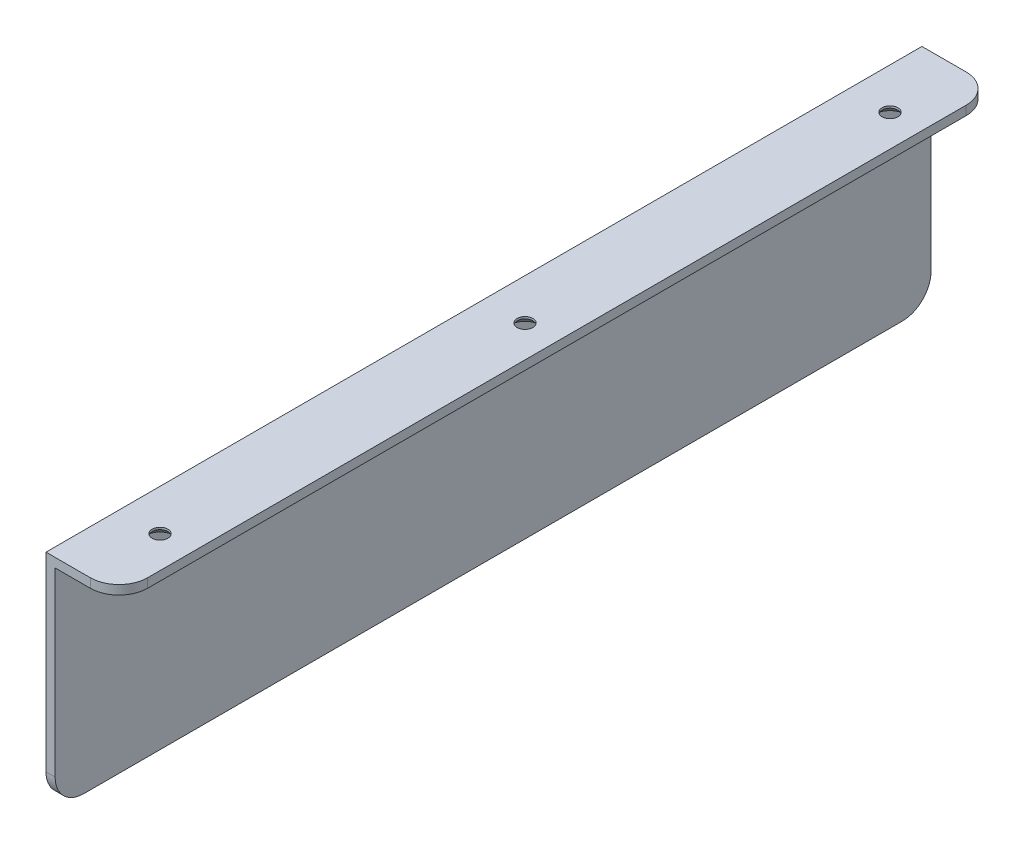
ISO-10303-21;
HEADER;
FILE_DESCRIPTION(('STEP AP214'),'2;1');
FILE_NAME('part.step','',(''),(''),'','','');
FILE_SCHEMA(('AUTOMOTIVE_DESIGN { 1 0 10303 214 1 1 1 1 }'));
ENDSEC;
DATA;
#1=APPLICATION_CONTEXT('core data for automotive mechanical design processes');
#2=APPLICATION_PROTOCOL_DEFINITION('international standard','automotive_design',2000,#1);
#3=PRODUCT_CONTEXT('',#1,'mechanical');
#4=PRODUCT('Part','Part','',(#3));
#5=PRODUCT_RELATED_PRODUCT_CATEGORY('part','',(#4));
#6=PRODUCT_DEFINITION_FORMATION('','',#4);
#7=PRODUCT_DEFINITION_CONTEXT('part definition',#1,'design');
#8=PRODUCT_DEFINITION('design','',#6,#7);
#9=PRODUCT_DEFINITION_SHAPE('','',#8);
#10=(LENGTH_UNIT() NAMED_UNIT(*) SI_UNIT(.MILLI.,.METRE.));
#11=(NAMED_UNIT(*) PLANE_ANGLE_UNIT() SI_UNIT($,.RADIAN.));
#12=(NAMED_UNIT(*) SI_UNIT($,.STERADIAN.) SOLID_ANGLE_UNIT());
#13=UNCERTAINTY_MEASURE_WITH_UNIT(LENGTH_MEASURE(1.E-05),#10,'distance_accuracy_value','');
#14=(GEOMETRIC_REPRESENTATION_CONTEXT(3) GLOBAL_UNCERTAINTY_ASSIGNED_CONTEXT((#13)) GLOBAL_UNIT_ASSIGNED_CONTEXT((#10,
#11,#12)) REPRESENTATION_CONTEXT('',''));
#15=CARTESIAN_POINT('',(0.,0.,0.));
#16=DIRECTION('',(0.,0.,1.));
#17=DIRECTION('',(1.,0.,0.));
#18=AXIS2_PLACEMENT_3D('',#15,#16,#17);
#19=CARTESIAN_POINT('',(-25.4,0.,152.4));
#20=DIRECTION('',(1.,0.,0.));
#21=DIRECTION('',(0.,1.,0.));
#22=AXIS2_PLACEMENT_3D('',#19,#20,#21);
#23=PLANE('',#22);
#24=DIRECTION('',(0.,-1.,0.));
#25=VECTOR('',#24,1.);
#26=CARTESIAN_POINT('',(-25.4,0.,-152.4));
#27=LINE('',#26,#25);
#28=CARTESIAN_POINT('',(-25.4,0.,-152.4));
#29=VERTEX_POINT('',#28);
#30=CARTESIAN_POINT('',(-25.4,-66.2,-152.4));
#31=VERTEX_POINT('',#30);
#32=EDGE_CURVE('E154',#29,#31,#27,.T.);
#33=ORIENTED_EDGE('',*,*,#32,.T.);
#34=CARTESIAN_POINT('',(-25.4,-66.2,-142.4));
#35=DIRECTION('',(1.,0.,0.));
#36=DIRECTION('',(0.,1.,0.));
#37=AXIS2_PLACEMENT_3D('',#34,#35,#36);
#38=CIRCLE('',#37,10.);
#39=CARTESIAN_POINT('',(-25.4,-76.2,-142.4));
#40=VERTEX_POINT('',#39);
#41=EDGE_CURVE('E191',#31,#40,#38,.F.);
#42=ORIENTED_EDGE('',*,*,#41,.T.);
#43=DIRECTION('',(0.,0.,-1.));
#44=VECTOR('',#43,1.);
#45=CARTESIAN_POINT('',(-25.4,-76.2,152.4));
#46=LINE('',#45,#44);
#47=CARTESIAN_POINT('',(-25.4,-76.2,142.4));
#48=VERTEX_POINT('',#47);
#49=EDGE_CURVE('E176',#48,#40,#46,.T.);
#50=ORIENTED_EDGE('',*,*,#49,.F.);
#51=CARTESIAN_POINT('',(-25.4,-66.2,142.4));
#52=DIRECTION('',(1.,0.,0.));
#53=DIRECTION('',(0.,1.,0.));
#54=AXIS2_PLACEMENT_3D('',#51,#52,#53);
#55=CIRCLE('',#54,10.);
#56=CARTESIAN_POINT('',(-25.4,-66.2,152.4));
#57=VERTEX_POINT('',#56);
#58=EDGE_CURVE('E188',#48,#57,#55,.F.);
#59=ORIENTED_EDGE('',*,*,#58,.T.);
#60=DIRECTION('',(0.,-1.,0.));
#61=VECTOR('',#60,1.);
#62=CARTESIAN_POINT('',(-25.4,0.,152.4));
#63=LINE('',#62,#61);
#64=CARTESIAN_POINT('',(-25.4,0.,152.4));
#65=VERTEX_POINT('',#64);
#66=EDGE_CURVE('E144',#65,#57,#63,.T.);
#67=ORIENTED_EDGE('',*,*,#66,.F.);
#68=DIRECTION('',(0.,0.,-1.));
#69=VECTOR('',#68,1.);
#70=CARTESIAN_POINT('',(-25.4,0.,152.4));
#71=LINE('',#70,#69);
#72=EDGE_CURVE('E153',#65,#29,#71,.T.);
#73=ORIENTED_EDGE('',*,*,#72,.T.);
#74=EDGE_LOOP('',(#33,#42,#50,#59,#67,#73));
#75=FACE_BOUND('',#74,.T.);
#76=ADVANCED_FACE('F38',(#75),#23,.F.);
#77=CARTESIAN_POINT('',(-22.225,-76.2,152.4));
#78=DIRECTION('',(0.,-1.,0.));
#79=DIRECTION('',(0.,0.,-1.));
#80=AXIS2_PLACEMENT_3D('',#77,#78,#79);
#81=PLANE('',#80);
#82=ORIENTED_EDGE('',*,*,#49,.T.);
#83=DIRECTION('',(-1.,0.,0.));
#84=VECTOR('',#83,1.);
#85=CARTESIAN_POINT('',(-22.225,-76.2,-142.4));
#86=LINE('',#85,#84);
#87=CARTESIAN_POINT('',(-22.225,-76.2,-142.4));
#88=VERTEX_POINT('',#87);
#89=EDGE_CURVE('E198',#40,#88,#86,.F.);
#90=ORIENTED_EDGE('',*,*,#89,.T.);
#91=DIRECTION('',(0.,0.,-1.));
#92=VECTOR('',#91,1.);
#93=CARTESIAN_POINT('',(-22.225,-76.2,152.4));
#94=LINE('',#93,#92);
#95=CARTESIAN_POINT('',(-22.225,-76.2,142.4));
#96=VERTEX_POINT('',#95);
#97=EDGE_CURVE('E137',#96,#88,#94,.T.);
#98=ORIENTED_EDGE('',*,*,#97,.F.);
#99=DIRECTION('',(-1.,0.,0.));
#100=VECTOR('',#99,1.);
#101=CARTESIAN_POINT('',(-25.4,-76.2,142.4));
#102=LINE('',#101,#100);
#103=EDGE_CURVE('E194',#96,#48,#102,.T.);
#104=ORIENTED_EDGE('',*,*,#103,.T.);
#105=EDGE_LOOP('',(#82,#90,#98,#104));
#106=FACE_BOUND('',#105,.T.);
#107=ADVANCED_FACE('F247',(#106),#81,.T.);
#108=CARTESIAN_POINT('',(-22.225,0.,152.4));
#109=DIRECTION('',(1.,0.,0.));
#110=DIRECTION('',(0.,1.,0.));
#111=AXIS2_PLACEMENT_3D('',#108,#109,#110);
#112=PLANE('',#111);
#113=ORIENTED_EDGE('',*,*,#97,.T.);
#114=CARTESIAN_POINT('',(-22.225,-66.2,-142.4));
#115=DIRECTION('',(1.,0.,0.));
#116=DIRECTION('',(0.,1.,0.));
#117=AXIS2_PLACEMENT_3D('',#114,#115,#116);
#118=CIRCLE('',#117,10.);
#119=CARTESIAN_POINT('',(-22.225,-66.2,-152.4));
#120=VERTEX_POINT('',#119);
#121=EDGE_CURVE('E204',#88,#120,#118,.T.);
#122=ORIENTED_EDGE('',*,*,#121,.T.);
#123=DIRECTION('',(0.,-1.,0.));
#124=VECTOR('',#123,1.);
#125=CARTESIAN_POINT('',(-22.225,0.,-152.4));
#126=LINE('',#125,#124);
#127=CARTESIAN_POINT('',(-22.225,-3.175,-152.4));
#128=VERTEX_POINT('',#127);
#129=EDGE_CURVE('E135',#128,#120,#126,.T.);
#130=ORIENTED_EDGE('',*,*,#129,.F.);
#131=DIRECTION('',(0.,0.,-1.));
#132=VECTOR('',#131,1.);
#133=CARTESIAN_POINT('',(-22.225,-3.175,152.4));
#134=LINE('',#133,#132);
#135=CARTESIAN_POINT('',(-22.225,-3.175,152.4));
#136=VERTEX_POINT('',#135);
#137=EDGE_CURVE('E120',#136,#128,#134,.T.);
#138=ORIENTED_EDGE('',*,*,#137,.F.);
#139=DIRECTION('',(0.,-1.,0.));
#140=VECTOR('',#139,1.);
#141=CARTESIAN_POINT('',(-22.225,0.,152.4));
#142=LINE('',#141,#140);
#143=CARTESIAN_POINT('',(-22.225,-66.2,152.4));
#144=VERTEX_POINT('',#143);
#145=EDGE_CURVE('E127',#136,#144,#142,.T.);
#146=ORIENTED_EDGE('',*,*,#145,.T.);
#147=CARTESIAN_POINT('',(-22.225,-66.2,142.4));
#148=DIRECTION('',(1.,0.,0.));
#149=DIRECTION('',(0.,1.,0.));
#150=AXIS2_PLACEMENT_3D('',#147,#148,#149);
#151=CIRCLE('',#150,10.);
#152=EDGE_CURVE('E201',#144,#96,#151,.T.);
#153=ORIENTED_EDGE('',*,*,#152,.T.);
#154=EDGE_LOOP('',(#113,#122,#130,#138,#146,#153));
#155=FACE_BOUND('',#154,.T.);
#156=ADVANCED_FACE('F132',(#155),#112,.T.);
#157=CARTESIAN_POINT('',(0.,-3.175,152.4));
#158=DIRECTION('',(0.,-1.,0.));
#159=DIRECTION('',(0.,0.,-1.));
#160=AXIS2_PLACEMENT_3D('',#157,#158,#159);
#161=PLANE('',#160);
#162=CARTESIAN_POINT('',(-11.1125,-3.175,127.));
#163=DIRECTION('',(0.,-1.,0.));
#164=DIRECTION('',(0.,0.,-1.));
#165=AXIS2_PLACEMENT_3D('',#162,#163,#164);
#166=CIRCLE('',#165,5.2);
#167=CARTESIAN_POINT('',(-11.1125,-3.175,121.8));
#168=VERTEX_POINT('',#167);
#169=EDGE_CURVE('E415',#168,#168,#166,.T.);
#170=ORIENTED_EDGE('',*,*,#169,.F.);
#171=EDGE_LOOP('',(#170));
#172=FACE_BOUND('',#171,.T.);
#173=CARTESIAN_POINT('',(-11.1125,-3.175,0.));
#174=DIRECTION('',(0.,-1.,0.));
#175=DIRECTION('',(0.,0.,-1.));
#176=AXIS2_PLACEMENT_3D('',#173,#174,#175);
#177=CIRCLE('',#176,5.2);
#178=CARTESIAN_POINT('',(-11.1125,-3.175,-5.2));
#179=VERTEX_POINT('',#178);
#180=EDGE_CURVE('E425',#179,#179,#177,.T.);
#181=ORIENTED_EDGE('',*,*,#180,.F.);
#182=EDGE_LOOP('',(#181));
#183=FACE_BOUND('',#182,.T.);
#184=CARTESIAN_POINT('',(-11.1125,-3.175,-127.));
#185=DIRECTION('',(0.,-1.,0.));
#186=DIRECTION('',(0.,0.,-1.));
#187=AXIS2_PLACEMENT_3D('',#184,#185,#186);
#188=CIRCLE('',#187,5.2);
#189=CARTESIAN_POINT('',(-11.1125,-3.175,-132.2));
#190=VERTEX_POINT('',#189);
#191=EDGE_CURVE('E437',#190,#190,#188,.T.);
#192=ORIENTED_EDGE('',*,*,#191,.F.);
#193=EDGE_LOOP('',(#192));
#194=FACE_BOUND('',#193,.T.);
#195=DIRECTION('',(1.,0.,0.));
#196=VECTOR('',#195,1.);
#197=CARTESIAN_POINT('',(0.,-3.175,-152.4));
#198=LINE('',#197,#196);
#199=CARTESIAN_POINT('',(-10.,-3.175,-152.4));
#200=VERTEX_POINT('',#199);
#201=EDGE_CURVE('E161',#200,#128,#198,.F.);
#202=ORIENTED_EDGE('',*,*,#201,.F.);
#203=CARTESIAN_POINT('',(-10.,-3.175,-142.4));
#204=DIRECTION('',(0.,-1.,0.));
#205=DIRECTION('',(0.,0.,-1.));
#206=AXIS2_PLACEMENT_3D('',#203,#204,#205);
#207=CIRCLE('',#206,10.);
#208=CARTESIAN_POINT('',(0.,-3.175,-142.4));
#209=VERTEX_POINT('',#208);
#210=EDGE_CURVE('E209',#200,#209,#207,.T.);
#211=ORIENTED_EDGE('',*,*,#210,.T.);
#212=DIRECTION('',(0.,0.,-1.));
#213=VECTOR('',#212,1.);
#214=CARTESIAN_POINT('',(0.,-3.175,152.4));
#215=LINE('',#214,#213);
#216=CARTESIAN_POINT('',(0.,-3.175,142.4));
#217=VERTEX_POINT('',#216);
#218=EDGE_CURVE('E138',#217,#209,#215,.T.);
#219=ORIENTED_EDGE('',*,*,#218,.F.);
#220=CARTESIAN_POINT('',(-10.,-3.175,142.4));
#221=DIRECTION('',(0.,-1.,0.));
#222=DIRECTION('',(0.,0.,-1.));
#223=AXIS2_PLACEMENT_3D('',#220,#221,#222);
#224=CIRCLE('',#223,10.);
#225=CARTESIAN_POINT('',(-10.,-3.175,152.4));
#226=VERTEX_POINT('',#225);
#227=EDGE_CURVE('E123',#217,#226,#224,.T.);
#228=ORIENTED_EDGE('',*,*,#227,.T.);
#229=DIRECTION('',(1.,0.,0.));
#230=VECTOR('',#229,1.);
#231=CARTESIAN_POINT('',(0.,-3.175,152.4));
#232=LINE('',#231,#230);
#233=EDGE_CURVE('E116',#226,#136,#232,.F.);
#234=ORIENTED_EDGE('',*,*,#233,.T.);
#235=ORIENTED_EDGE('',*,*,#137,.T.);
#236=EDGE_LOOP('',(#202,#211,#219,#228,#234,#235));
#237=FACE_BOUND('',#236,.T.);
#238=ADVANCED_FACE('F119',(#172,#183,#194,#237),#161,.T.);
#239=CARTESIAN_POINT('',(0.,0.,152.4));
#240=DIRECTION('',(1.,0.,0.));
#241=DIRECTION('',(0.,0.,-1.));
#242=AXIS2_PLACEMENT_3D('',#239,#240,#241);
#243=PLANE('',#242);
#244=ORIENTED_EDGE('',*,*,#218,.T.);
#245=DIRECTION('',(0.,-1.,0.));
#246=VECTOR('',#245,1.);
#247=CARTESIAN_POINT('',(0.,0.,-142.4));
#248=LINE('',#247,#246);
#249=CARTESIAN_POINT('',(0.,0.,-142.4));
#250=VERTEX_POINT('',#249);
#251=EDGE_CURVE('E60',#209,#250,#248,.F.);
#252=ORIENTED_EDGE('',*,*,#251,.T.);
#253=DIRECTION('',(0.,0.,-1.));
#254=VECTOR('',#253,1.);
#255=CARTESIAN_POINT('',(0.,0.,152.4));
#256=LINE('',#255,#254);
#257=CARTESIAN_POINT('',(0.,0.,142.4));
#258=VERTEX_POINT('',#257);
#259=EDGE_CURVE('E169',#258,#250,#256,.T.);
#260=ORIENTED_EDGE('',*,*,#259,.F.);
#261=DIRECTION('',(0.,-1.,0.));
#262=VECTOR('',#261,1.);
#263=CARTESIAN_POINT('',(0.,-3.175,142.4));
#264=LINE('',#263,#262);
#265=EDGE_CURVE('E212',#258,#217,#264,.T.);
#266=ORIENTED_EDGE('',*,*,#265,.T.);
#267=EDGE_LOOP('',(#244,#252,#260,#266));
#268=FACE_BOUND('',#267,.T.);
#269=ADVANCED_FACE('F235',(#268),#243,.T.);
#270=CARTESIAN_POINT('',(0.,0.,152.4));
#271=DIRECTION('',(0.,-1.,0.));
#272=DIRECTION('',(0.,0.,-1.));
#273=AXIS2_PLACEMENT_3D('',#270,#271,#272);
#274=PLANE('',#273);
#275=CARTESIAN_POINT('',(-11.1125,0.,127.));
#276=DIRECTION('',(0.,-1.,0.));
#277=DIRECTION('',(0.,0.,-1.));
#278=AXIS2_PLACEMENT_3D('',#275,#276,#277);
#279=CIRCLE('',#278,2.75);
#280=CARTESIAN_POINT('',(-11.1125,0.,124.25));
#281=VERTEX_POINT('',#280);
#282=EDGE_CURVE('E419',#281,#281,#279,.T.);
#283=ORIENTED_EDGE('',*,*,#282,.T.);
#284=EDGE_LOOP('',(#283));
#285=FACE_BOUND('',#284,.T.);
#286=CARTESIAN_POINT('',(-11.1125,0.,0.));
#287=DIRECTION('',(0.,-1.,0.));
#288=DIRECTION('',(0.,0.,-1.));
#289=AXIS2_PLACEMENT_3D('',#286,#287,#288);
#290=CIRCLE('',#289,2.75);
#291=CARTESIAN_POINT('',(-11.1125,0.,-2.75));
#292=VERTEX_POINT('',#291);
#293=EDGE_CURVE('E433',#292,#292,#290,.T.);
#294=ORIENTED_EDGE('',*,*,#293,.T.);
#295=EDGE_LOOP('',(#294));
#296=FACE_BOUND('',#295,.T.);
#297=CARTESIAN_POINT('',(-11.1125,0.,-127.));
#298=DIRECTION('',(0.,-1.,0.));
#299=DIRECTION('',(0.,0.,-1.));
#300=AXIS2_PLACEMENT_3D('',#297,#298,#299);
#301=CIRCLE('',#300,2.75);
#302=CARTESIAN_POINT('',(-11.1125,0.,-129.75));
#303=VERTEX_POINT('',#302);
#304=EDGE_CURVE('E158',#303,#303,#301,.T.);
#305=ORIENTED_EDGE('',*,*,#304,.T.);
#306=EDGE_LOOP('',(#305));
#307=FACE_BOUND('',#306,.T.);
#308=ORIENTED_EDGE('',*,*,#259,.T.);
#309=CARTESIAN_POINT('',(-10.,0.,-142.4));
#310=DIRECTION('',(0.,-1.,0.));
#311=DIRECTION('',(0.,0.,-1.));
#312=AXIS2_PLACEMENT_3D('',#309,#310,#311);
#313=CIRCLE('',#312,10.);
#314=CARTESIAN_POINT('',(-10.,0.,-152.4));
#315=VERTEX_POINT('',#314);
#316=EDGE_CURVE('E221',#250,#315,#313,.F.);
#317=ORIENTED_EDGE('',*,*,#316,.T.);
#318=DIRECTION('',(-1.,0.,0.));
#319=VECTOR('',#318,1.);
#320=CARTESIAN_POINT('',(0.,0.,-152.4));
#321=LINE('',#320,#319);
#322=EDGE_CURVE('E147',#315,#29,#321,.T.);
#323=ORIENTED_EDGE('',*,*,#322,.T.);
#324=ORIENTED_EDGE('',*,*,#72,.F.);
#325=DIRECTION('',(-1.,0.,0.));
#326=VECTOR('',#325,1.);
#327=CARTESIAN_POINT('',(0.,0.,152.4));
#328=LINE('',#327,#326);
#329=CARTESIAN_POINT('',(-10.,0.,152.4));
#330=VERTEX_POINT('',#329);
#331=EDGE_CURVE('E126',#330,#65,#328,.T.);
#332=ORIENTED_EDGE('',*,*,#331,.F.);
#333=CARTESIAN_POINT('',(-10.,0.,142.4));
#334=DIRECTION('',(0.,-1.,0.));
#335=DIRECTION('',(0.,0.,-1.));
#336=AXIS2_PLACEMENT_3D('',#333,#334,#335);
#337=CIRCLE('',#336,10.);
#338=EDGE_CURVE('E218',#330,#258,#337,.F.);
#339=ORIENTED_EDGE('',*,*,#338,.T.);
#340=EDGE_LOOP('',(#308,#317,#323,#324,#332,#339));
#341=FACE_BOUND('',#340,.T.);
#342=ADVANCED_FACE('F227',(#285,#296,#307,#341),#274,.F.);
#343=CARTESIAN_POINT('',(0.,0.,152.4));
#344=DIRECTION('',(0.,0.,-1.));
#345=DIRECTION('',(-1.,0.,0.));
#346=AXIS2_PLACEMENT_3D('',#343,#344,#345);
#347=PLANE('',#346);
#348=ORIENTED_EDGE('',*,*,#233,.F.);
#349=DIRECTION('',(0.,-1.,0.));
#350=VECTOR('',#349,1.);
#351=CARTESIAN_POINT('',(-10.,0.,152.4));
#352=LINE('',#351,#350);
#353=EDGE_CURVE('E11',#226,#330,#352,.F.);
#354=ORIENTED_EDGE('',*,*,#353,.T.);
#355=ORIENTED_EDGE('',*,*,#331,.T.);
#356=ORIENTED_EDGE('',*,*,#66,.T.);
#357=DIRECTION('',(-1.,0.,0.));
#358=VECTOR('',#357,1.);
#359=CARTESIAN_POINT('',(-22.225,-66.2,152.4));
#360=LINE('',#359,#358);
#361=EDGE_CURVE('E47',#57,#144,#360,.F.);
#362=ORIENTED_EDGE('',*,*,#361,.T.);
#363=ORIENTED_EDGE('',*,*,#145,.F.);
#364=EDGE_LOOP('',(#348,#354,#355,#356,#362,#363));
#365=FACE_BOUND('',#364,.T.);
#366=ADVANCED_FACE('F140',(#365),#347,.F.);
#367=CARTESIAN_POINT('',(0.,0.,-152.4));
#368=DIRECTION('',(0.,0.,-1.));
#369=DIRECTION('',(-1.,0.,0.));
#370=AXIS2_PLACEMENT_3D('',#367,#368,#369);
#371=PLANE('',#370);
#372=ORIENTED_EDGE('',*,*,#129,.T.);
#373=DIRECTION('',(-1.,0.,0.));
#374=VECTOR('',#373,1.);
#375=CARTESIAN_POINT('',(0.,-66.2,-152.4));
#376=LINE('',#375,#374);
#377=EDGE_CURVE('E184',#120,#31,#376,.T.);
#378=ORIENTED_EDGE('',*,*,#377,.T.);
#379=ORIENTED_EDGE('',*,*,#32,.F.);
#380=ORIENTED_EDGE('',*,*,#322,.F.);
#381=DIRECTION('',(0.,-1.,0.));
#382=VECTOR('',#381,1.);
#383=CARTESIAN_POINT('',(-10.,0.,-152.4));
#384=LINE('',#383,#382);
#385=EDGE_CURVE('E180',#315,#200,#384,.T.);
#386=ORIENTED_EDGE('',*,*,#385,.T.);
#387=ORIENTED_EDGE('',*,*,#201,.T.);
#388=EDGE_LOOP('',(#372,#378,#379,#380,#386,#387));
#389=FACE_BOUND('',#388,.T.);
#390=ADVANCED_FACE('F233',(#389),#371,.T.);
#391=CARTESIAN_POINT('',(-11.1125,-3.175,-127.));
#392=DIRECTION('',(0.,-1.,0.));
#393=DIRECTION('',(0.,0.,-1.));
#394=AXIS2_PLACEMENT_3D('',#391,#392,#393);
#395=CYLINDRICAL_SURFACE('',#394,2.75);
#396=ORIENTED_EDGE('',*,*,#304,.F.);
#397=EDGE_LOOP('',(#396));
#398=FACE_BOUND('',#397,.T.);
#399=CARTESIAN_POINT('',(-11.1125,-0.724999999999998,-127.));
#400=DIRECTION('',(0.,-1.,0.));
#401=DIRECTION('',(0.,0.,-1.));
#402=AXIS2_PLACEMENT_3D('',#399,#400,#401);
#403=CIRCLE('',#402,2.75);
#404=CARTESIAN_POINT('',(-11.1125,-0.724999999999998,-129.75));
#405=VERTEX_POINT('',#404);
#406=EDGE_CURVE('E441',#405,#405,#403,.T.);
#407=ORIENTED_EDGE('',*,*,#406,.T.);
#408=EDGE_LOOP('',(#407));
#409=FACE_BOUND('',#408,.T.);
#410=ADVANCED_FACE('F298',(#398,#409),#395,.F.);
#411=CARTESIAN_POINT('',(-11.1125,-3.175,-127.));
#412=DIRECTION('',(0.,-1.,0.));
#413=DIRECTION('',(0.,0.,-1.));
#414=AXIS2_PLACEMENT_3D('',#411,#412,#413);
#415=CONICAL_SURFACE('',#414,5.2,0.785398163397448);
#416=ORIENTED_EDGE('',*,*,#406,.F.);
#417=EDGE_LOOP('',(#416));
#418=FACE_BOUND('',#417,.T.);
#419=ORIENTED_EDGE('',*,*,#191,.T.);
#420=EDGE_LOOP('',(#419));
#421=FACE_BOUND('',#420,.T.);
#422=ADVANCED_FACE('F360',(#418,#421),#415,.F.);
#423=CARTESIAN_POINT('',(-11.1125,-3.175,0.));
#424=DIRECTION('',(0.,-1.,0.));
#425=DIRECTION('',(0.,0.,-1.));
#426=AXIS2_PLACEMENT_3D('',#423,#424,#425);
#427=CYLINDRICAL_SURFACE('',#426,2.75);
#428=ORIENTED_EDGE('',*,*,#293,.F.);
#429=EDGE_LOOP('',(#428));
#430=FACE_BOUND('',#429,.T.);
#431=CARTESIAN_POINT('',(-11.1125,-0.724999999999998,0.));
#432=DIRECTION('',(0.,-1.,0.));
#433=DIRECTION('',(0.,0.,-1.));
#434=AXIS2_PLACEMENT_3D('',#431,#432,#433);
#435=CIRCLE('',#434,2.75);
#436=CARTESIAN_POINT('',(-11.1125,-0.724999999999998,-2.75));
#437=VERTEX_POINT('',#436);
#438=EDGE_CURVE('E429',#437,#437,#435,.T.);
#439=ORIENTED_EDGE('',*,*,#438,.T.);
#440=EDGE_LOOP('',(#439));
#441=FACE_BOUND('',#440,.T.);
#442=ADVANCED_FACE('F369',(#430,#441),#427,.F.);
#443=CARTESIAN_POINT('',(-11.1125,-3.175,0.));
#444=DIRECTION('',(0.,-1.,0.));
#445=DIRECTION('',(0.,0.,-1.));
#446=AXIS2_PLACEMENT_3D('',#443,#444,#445);
#447=CONICAL_SURFACE('',#446,5.2,0.785398163397448);
#448=ORIENTED_EDGE('',*,*,#438,.F.);
#449=EDGE_LOOP('',(#448));
#450=FACE_BOUND('',#449,.T.);
#451=ORIENTED_EDGE('',*,*,#180,.T.);
#452=EDGE_LOOP('',(#451));
#453=FACE_BOUND('',#452,.T.);
#454=ADVANCED_FACE('F378',(#450,#453),#447,.F.);
#455=CARTESIAN_POINT('',(-11.1125,-3.175,127.));
#456=DIRECTION('',(0.,-1.,0.));
#457=DIRECTION('',(0.,0.,-1.));
#458=AXIS2_PLACEMENT_3D('',#455,#456,#457);
#459=CYLINDRICAL_SURFACE('',#458,2.75);
#460=ORIENTED_EDGE('',*,*,#282,.F.);
#461=EDGE_LOOP('',(#460));
#462=FACE_BOUND('',#461,.T.);
#463=CARTESIAN_POINT('',(-11.1125,-0.724999999999998,127.));
#464=DIRECTION('',(0.,-1.,0.));
#465=DIRECTION('',(0.,0.,-1.));
#466=AXIS2_PLACEMENT_3D('',#463,#464,#465);
#467=CIRCLE('',#466,2.75);
#468=CARTESIAN_POINT('',(-11.1125,-0.724999999999998,124.25));
#469=VERTEX_POINT('',#468);
#470=EDGE_CURVE('E412',#469,#469,#467,.T.);
#471=ORIENTED_EDGE('',*,*,#470,.T.);
#472=EDGE_LOOP('',(#471));
#473=FACE_BOUND('',#472,.T.);
#474=ADVANCED_FACE('F387',(#462,#473),#459,.F.);
#475=CARTESIAN_POINT('',(-11.1125,-3.175,127.));
#476=DIRECTION('',(0.,-1.,0.));
#477=DIRECTION('',(0.,0.,-1.));
#478=AXIS2_PLACEMENT_3D('',#475,#476,#477);
#479=CONICAL_SURFACE('',#478,5.2,0.785398163397448);
#480=ORIENTED_EDGE('',*,*,#470,.F.);
#481=EDGE_LOOP('',(#480));
#482=FACE_BOUND('',#481,.T.);
#483=ORIENTED_EDGE('',*,*,#169,.T.);
#484=EDGE_LOOP('',(#483));
#485=FACE_BOUND('',#484,.T.);
#486=ADVANCED_FACE('F264',(#482,#485),#479,.F.);
#487=CARTESIAN_POINT('',(0.,-66.2,-142.4));
#488=DIRECTION('',(-1.,0.,0.));
#489=DIRECTION('',(0.,0.,1.));
#490=AXIS2_PLACEMENT_3D('',#487,#488,#489);
#491=CYLINDRICAL_SURFACE('',#490,10.);
#492=ORIENTED_EDGE('',*,*,#121,.F.);
#493=ORIENTED_EDGE('',*,*,#89,.F.);
#494=ORIENTED_EDGE('',*,*,#41,.F.);
#495=ORIENTED_EDGE('',*,*,#377,.F.);
#496=EDGE_LOOP('',(#492,#493,#494,#495));
#497=FACE_BOUND('',#496,.T.);
#498=ADVANCED_FACE('F251',(#497),#491,.T.);
#499=CARTESIAN_POINT('',(-10.,0.,-142.4));
#500=DIRECTION('',(0.,-1.,0.));
#501=DIRECTION('',(0.,0.,-1.));
#502=AXIS2_PLACEMENT_3D('',#499,#500,#501);
#503=CYLINDRICAL_SURFACE('',#502,10.);
#504=ORIENTED_EDGE('',*,*,#316,.F.);
#505=ORIENTED_EDGE('',*,*,#251,.F.);
#506=ORIENTED_EDGE('',*,*,#210,.F.);
#507=ORIENTED_EDGE('',*,*,#385,.F.);
#508=EDGE_LOOP('',(#504,#505,#506,#507));
#509=FACE_BOUND('',#508,.T.);
#510=ADVANCED_FACE('F234',(#509),#503,.T.);
#511=CARTESIAN_POINT('',(-10.,0.,142.4));
#512=DIRECTION('',(0.,1.,0.));
#513=DIRECTION('',(0.,0.,1.));
#514=AXIS2_PLACEMENT_3D('',#511,#512,#513);
#515=CYLINDRICAL_SURFACE('',#514,10.);
#516=ORIENTED_EDGE('',*,*,#338,.F.);
#517=ORIENTED_EDGE('',*,*,#353,.F.);
#518=ORIENTED_EDGE('',*,*,#227,.F.);
#519=ORIENTED_EDGE('',*,*,#265,.F.);
#520=EDGE_LOOP('',(#516,#517,#518,#519));
#521=FACE_BOUND('',#520,.T.);
#522=ADVANCED_FACE('F239',(#521),#515,.T.);
#523=CARTESIAN_POINT('',(-22.225,-66.2,142.4));
#524=DIRECTION('',(1.,0.,0.));
#525=DIRECTION('',(0.,0.,-1.));
#526=AXIS2_PLACEMENT_3D('',#523,#524,#525);
#527=CYLINDRICAL_SURFACE('',#526,10.);
#528=ORIENTED_EDGE('',*,*,#152,.F.);
#529=ORIENTED_EDGE('',*,*,#361,.F.);
#530=ORIENTED_EDGE('',*,*,#58,.F.);
#531=ORIENTED_EDGE('',*,*,#103,.F.);
#532=EDGE_LOOP('',(#528,#529,#530,#531));
#533=FACE_BOUND('',#532,.T.);
#534=ADVANCED_FACE('F40',(#533),#527,.T.);
#535=CLOSED_SHELL('',(#76,#107,#156,#238,#269,#342,#366,#390,#410,#422,#442,#454,#474,#486,#498,
#510,#522,#534));
#536=MANIFOLD_SOLID_BREP('B2',#535);
#537=ADVANCED_BREP_SHAPE_REPRESENTATION('',(#18,#536),#14);
#538=SHAPE_DEFINITION_REPRESENTATION(#9,#537);
ENDSEC;
END-ISO-10303-21;
